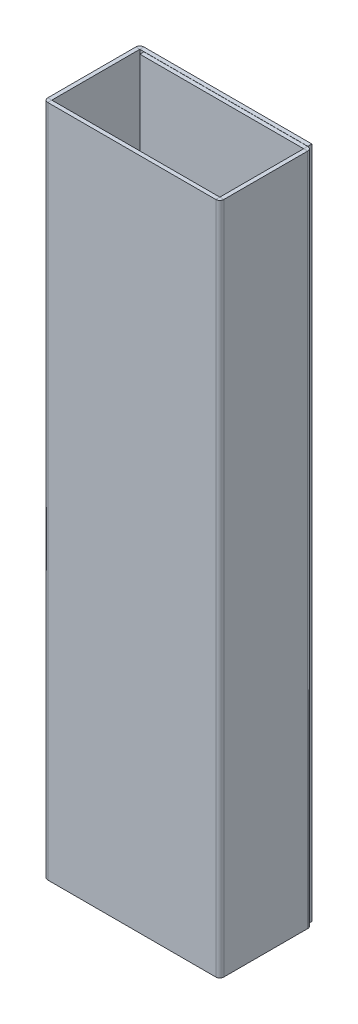
ISO-10303-21;
HEADER;
FILE_DESCRIPTION(('STEP AP214'),'2;1');
FILE_NAME('part.step','',(''),(''),'','','');
FILE_SCHEMA(('AUTOMOTIVE_DESIGN { 1 0 10303 214 1 1 1 1 }'));
ENDSEC;
DATA;
#1=APPLICATION_CONTEXT('core data for automotive mechanical design processes');
#2=APPLICATION_PROTOCOL_DEFINITION('international standard','automotive_design',2000,#1);
#3=PRODUCT_CONTEXT('',#1,'mechanical');
#4=PRODUCT('Part','Part','',(#3));
#5=PRODUCT_RELATED_PRODUCT_CATEGORY('part','',(#4));
#6=PRODUCT_DEFINITION_FORMATION('','',#4);
#7=PRODUCT_DEFINITION_CONTEXT('part definition',#1,'design');
#8=PRODUCT_DEFINITION('design','',#6,#7);
#9=PRODUCT_DEFINITION_SHAPE('','',#8);
#10=(LENGTH_UNIT() NAMED_UNIT(*) SI_UNIT(.MILLI.,.METRE.));
#11=(NAMED_UNIT(*) PLANE_ANGLE_UNIT() SI_UNIT($,.RADIAN.));
#12=(NAMED_UNIT(*) SI_UNIT($,.STERADIAN.) SOLID_ANGLE_UNIT());
#13=UNCERTAINTY_MEASURE_WITH_UNIT(LENGTH_MEASURE(1.E-05),#10,'distance_accuracy_value','');
#14=(GEOMETRIC_REPRESENTATION_CONTEXT(3) GLOBAL_UNCERTAINTY_ASSIGNED_CONTEXT((#13)) GLOBAL_UNIT_ASSIGNED_CONTEXT((#10,
#11,#12)) REPRESENTATION_CONTEXT('',''));
#15=CARTESIAN_POINT('',(0.,0.,0.));
#16=DIRECTION('',(0.,0.,1.));
#17=DIRECTION('',(1.,0.,0.));
#18=AXIS2_PLACEMENT_3D('',#15,#16,#17);
#19=CARTESIAN_POINT('',(-4.99,40.,-2.614));
#20=DIRECTION('',(0.,1.,0.));
#21=DIRECTION('',(0.,0.,1.));
#22=AXIS2_PLACEMENT_3D('',#19,#20,#21);
#23=PLANE('',#22);
#24=DIRECTION('',(-1.,0.,0.));
#25=VECTOR('',#24,1.);
#26=CARTESIAN_POINT('',(-4.99,40.,-2.614));
#27=LINE('',#26,#25);
#28=CARTESIAN_POINT('',(-4.99,40.,-2.614));
#29=VERTEX_POINT('',#28);
#30=CARTESIAN_POINT('',(-5.23,40.,-2.614));
#31=VERTEX_POINT('',#30);
#32=EDGE_CURVE('E11',#29,#31,#27,.T.);
#33=ORIENTED_EDGE('',*,*,#32,.F.);
#34=CARTESIAN_POINT('',(-4.989,40.,-2.614));
#35=DIRECTION('',(0.,-1.,0.));
#36=DIRECTION('',(0.,0.,-1.));
#37=AXIS2_PLACEMENT_3D('',#34,#35,#36);
#38=CIRCLE('',#37,0.001);
#39=CARTESIAN_POINT('',(-4.989,40.,-2.615));
#40=VERTEX_POINT('',#39);
#41=EDGE_CURVE('E366',#40,#29,#38,.F.);
#42=ORIENTED_EDGE('',*,*,#41,.F.);
#43=DIRECTION('',(0.,0.,1.));
#44=VECTOR('',#43,1.);
#45=CARTESIAN_POINT('',(-4.989,40.,-2.855));
#46=LINE('',#45,#44);
#47=CARTESIAN_POINT('',(-4.989,40.,-2.855));
#48=VERTEX_POINT('',#47);
#49=EDGE_CURVE('E45',#48,#40,#46,.T.);
#50=ORIENTED_EDGE('',*,*,#49,.F.);
#51=CARTESIAN_POINT('',(-4.989,40.,-2.614));
#52=DIRECTION('',(0.,1.,0.));
#53=DIRECTION('',(1.,0.,0.));
#54=AXIS2_PLACEMENT_3D('',#51,#52,#53);
#55=CIRCLE('',#54,0.241);
#56=EDGE_CURVE('E379',#48,#31,#55,.T.);
#57=ORIENTED_EDGE('',*,*,#56,.T.);
#58=EDGE_LOOP('',(#33,#42,#50,#57));
#59=FACE_BOUND('',#58,.T.);
#60=ADVANCED_FACE('F37',(#59),#23,.T.);
#61=CARTESIAN_POINT('',(-4.989,40.,-2.855));
#62=DIRECTION('',(0.,1.,0.));
#63=DIRECTION('',(0.,0.,1.));
#64=AXIS2_PLACEMENT_3D('',#61,#62,#63);
#65=PLANE('',#64);
#66=DIRECTION('',(0.,0.,1.));
#67=VECTOR('',#66,1.);
#68=CARTESIAN_POINT('',(-4.99,40.,-2.615));
#69=LINE('',#68,#67);
#70=CARTESIAN_POINT('',(-4.99,40.,2.614));
#71=VERTEX_POINT('',#70);
#72=EDGE_CURVE('E370',#29,#71,#69,.T.);
#73=ORIENTED_EDGE('',*,*,#72,.F.);
#74=ORIENTED_EDGE('',*,*,#32,.T.);
#75=DIRECTION('',(0.,0.,1.));
#76=VECTOR('',#75,1.);
#77=CARTESIAN_POINT('',(-5.23,40.,-2.615));
#78=LINE('',#77,#76);
#79=CARTESIAN_POINT('',(-5.23,40.,2.61399999999916));
#80=VERTEX_POINT('',#79);
#81=EDGE_CURVE('E381',#31,#80,#78,.T.);
#82=ORIENTED_EDGE('',*,*,#81,.T.);
#83=DIRECTION('',(1.,0.,3.46944695195362E-12));
#84=VECTOR('',#83,1.);
#85=CARTESIAN_POINT('',(-5.23,40.,2.61399999999916));
#86=LINE('',#85,#84);
#87=EDGE_CURVE('E340',#80,#71,#86,.T.);
#88=ORIENTED_EDGE('',*,*,#87,.T.);
#89=EDGE_LOOP('',(#73,#74,#82,#88));
#90=FACE_BOUND('',#89,.T.);
#91=ADVANCED_FACE('F450',(#90),#65,.T.);
#92=CARTESIAN_POINT('',(-4.989,0.,-2.615));
#93=DIRECTION('',(0.,-1.,0.));
#94=DIRECTION('',(0.,0.,-1.));
#95=AXIS2_PLACEMENT_3D('',#92,#93,#94);
#96=PLANE('',#95);
#97=DIRECTION('',(0.,0.,-1.));
#98=VECTOR('',#97,1.);
#99=CARTESIAN_POINT('',(-4.989,0.,-2.615));
#100=LINE('',#99,#98);
#101=CARTESIAN_POINT('',(-4.989,0.,-2.615));
#102=VERTEX_POINT('',#101);
#103=CARTESIAN_POINT('',(-4.989,0.,-2.855));
#104=VERTEX_POINT('',#103);
#105=EDGE_CURVE('E346',#102,#104,#100,.T.);
#106=ORIENTED_EDGE('',*,*,#105,.F.);
#107=CARTESIAN_POINT('',(-4.989,0.,-2.614));
#108=DIRECTION('',(0.,-1.,0.));
#109=DIRECTION('',(0.,0.,-1.));
#110=AXIS2_PLACEMENT_3D('',#107,#108,#109);
#111=CIRCLE('',#110,0.001);
#112=CARTESIAN_POINT('',(-4.99,0.,-2.614));
#113=VERTEX_POINT('',#112);
#114=EDGE_CURVE('E250',#102,#113,#111,.F.);
#115=ORIENTED_EDGE('',*,*,#114,.T.);
#116=DIRECTION('',(1.,0.,0.));
#117=VECTOR('',#116,1.);
#118=CARTESIAN_POINT('',(-5.23,0.,-2.614));
#119=LINE('',#118,#117);
#120=CARTESIAN_POINT('',(-5.23,0.,-2.614));
#121=VERTEX_POINT('',#120);
#122=EDGE_CURVE('E344',#121,#113,#119,.T.);
#123=ORIENTED_EDGE('',*,*,#122,.F.);
#124=CARTESIAN_POINT('',(-4.989,0.,-2.614));
#125=DIRECTION('',(0.,1.,0.));
#126=DIRECTION('',(1.,0.,0.));
#127=AXIS2_PLACEMENT_3D('',#124,#125,#126);
#128=CIRCLE('',#127,0.241);
#129=EDGE_CURVE('E262',#104,#121,#128,.T.);
#130=ORIENTED_EDGE('',*,*,#129,.F.);
#131=EDGE_LOOP('',(#106,#115,#123,#130));
#132=FACE_BOUND('',#131,.T.);
#133=ADVANCED_FACE('F492',(#132),#96,.T.);
#134=CARTESIAN_POINT('',(-5.23,0.,-2.614));
#135=DIRECTION('',(0.,-1.,0.));
#136=DIRECTION('',(0.,0.,-1.));
#137=AXIS2_PLACEMENT_3D('',#134,#135,#136);
#138=PLANE('',#137);
#139=DIRECTION('',(-1.,0.,0.));
#140=VECTOR('',#139,1.);
#141=CARTESIAN_POINT('',(4.99,0.,-2.615));
#142=LINE('',#141,#140);
#143=CARTESIAN_POINT('',(4.99,0.,-2.615));
#144=VERTEX_POINT('',#143);
#145=EDGE_CURVE('E253',#144,#102,#142,.T.);
#146=ORIENTED_EDGE('',*,*,#145,.T.);
#147=ORIENTED_EDGE('',*,*,#105,.T.);
#148=DIRECTION('',(-1.,0.,0.));
#149=VECTOR('',#148,1.);
#150=CARTESIAN_POINT('',(4.99,0.,-2.855));
#151=LINE('',#150,#149);
#152=CARTESIAN_POINT('',(4.99,0.,-2.855));
#153=VERTEX_POINT('',#152);
#154=EDGE_CURVE('E259',#153,#104,#151,.T.);
#155=ORIENTED_EDGE('',*,*,#154,.F.);
#156=DIRECTION('',(0.,0.,1.));
#157=VECTOR('',#156,1.);
#158=CARTESIAN_POINT('',(4.99,0.,-2.855));
#159=LINE('',#158,#157);
#160=EDGE_CURVE('E256',#153,#144,#159,.T.);
#161=ORIENTED_EDGE('',*,*,#160,.T.);
#162=EDGE_LOOP('',(#146,#147,#155,#161));
#163=FACE_BOUND('',#162,.T.);
#164=ADVANCED_FACE('F496',(#163),#138,.T.);
#165=CARTESIAN_POINT('',(-4.989,40.,2.615));
#166=DIRECTION('',(0.,1.,0.));
#167=DIRECTION('',(0.,0.,1.));
#168=AXIS2_PLACEMENT_3D('',#165,#166,#167);
#169=PLANE('',#168);
#170=DIRECTION('',(0.,0.,1.));
#171=VECTOR('',#170,1.);
#172=CARTESIAN_POINT('',(-4.989,40.,2.615));
#173=LINE('',#172,#171);
#174=CARTESIAN_POINT('',(-4.989,40.,2.615));
#175=VERTEX_POINT('',#174);
#176=CARTESIAN_POINT('',(-4.989,40.,2.855));
#177=VERTEX_POINT('',#176);
#178=EDGE_CURVE('E342',#175,#177,#173,.T.);
#179=ORIENTED_EDGE('',*,*,#178,.F.);
#180=CARTESIAN_POINT('',(-4.989,40.,2.614));
#181=DIRECTION('',(0.,-1.,0.));
#182=DIRECTION('',(0.,0.,-1.));
#183=AXIS2_PLACEMENT_3D('',#180,#181,#182);
#184=CIRCLE('',#183,0.001);
#185=EDGE_CURVE('E440',#71,#175,#184,.F.);
#186=ORIENTED_EDGE('',*,*,#185,.F.);
#187=ORIENTED_EDGE('',*,*,#87,.F.);
#188=CARTESIAN_POINT('',(-4.989,40.,2.614));
#189=DIRECTION('',(0.,1.,0.));
#190=DIRECTION('',(1.,0.,0.));
#191=AXIS2_PLACEMENT_3D('',#188,#189,#190);
#192=CIRCLE('',#191,0.241);
#193=EDGE_CURVE('E384',#80,#177,#192,.T.);
#194=ORIENTED_EDGE('',*,*,#193,.T.);
#195=EDGE_LOOP('',(#179,#186,#187,#194));
#196=FACE_BOUND('',#195,.T.);
#197=ADVANCED_FACE('F457',(#196),#169,.T.);
#198=CARTESIAN_POINT('',(-5.23,40.,2.61399999999916));
#199=DIRECTION('',(0.,1.,0.));
#200=DIRECTION('',(0.,0.,1.));
#201=AXIS2_PLACEMENT_3D('',#198,#199,#200);
#202=PLANE('',#201);
#203=DIRECTION('',(1.,0.,0.));
#204=VECTOR('',#203,1.);
#205=CARTESIAN_POINT('',(-4.99,40.,2.615));
#206=LINE('',#205,#204);
#207=CARTESIAN_POINT('',(4.989,40.,2.615));
#208=VERTEX_POINT('',#207);
#209=EDGE_CURVE('E437',#175,#208,#206,.T.);
#210=ORIENTED_EDGE('',*,*,#209,.F.);
#211=ORIENTED_EDGE('',*,*,#178,.T.);
#212=DIRECTION('',(1.,0.,0.));
#213=VECTOR('',#212,1.);
#214=CARTESIAN_POINT('',(-4.99,40.,2.855));
#215=LINE('',#214,#213);
#216=CARTESIAN_POINT('',(4.98899999999979,40.,2.855));
#217=VERTEX_POINT('',#216);
#218=EDGE_CURVE('E204',#177,#217,#215,.T.);
#219=ORIENTED_EDGE('',*,*,#218,.T.);
#220=DIRECTION('',(8.67361737988404E-13,0.,-1.));
#221=VECTOR('',#220,1.);
#222=CARTESIAN_POINT('',(4.98899999999979,40.,2.855));
#223=LINE('',#222,#221);
#224=EDGE_CURVE('E195',#217,#208,#223,.T.);
#225=ORIENTED_EDGE('',*,*,#224,.T.);
#226=EDGE_LOOP('',(#210,#211,#219,#225));
#227=FACE_BOUND('',#226,.T.);
#228=ADVANCED_FACE('F390',(#227),#202,.T.);
#229=CARTESIAN_POINT('',(-4.99,0.,2.614));
#230=DIRECTION('',(0.,-1.,0.));
#231=DIRECTION('',(0.,0.,-1.));
#232=AXIS2_PLACEMENT_3D('',#229,#230,#231);
#233=PLANE('',#232);
#234=DIRECTION('',(-1.,0.,-3.46944695195362E-12));
#235=VECTOR('',#234,1.);
#236=CARTESIAN_POINT('',(-4.99,0.,2.614));
#237=LINE('',#236,#235);
#238=CARTESIAN_POINT('',(-4.99,0.,2.614));
#239=VERTEX_POINT('',#238);
#240=CARTESIAN_POINT('',(-5.23,0.,2.61399999999916));
#241=VERTEX_POINT('',#240);
#242=EDGE_CURVE('E338',#239,#241,#237,.T.);
#243=ORIENTED_EDGE('',*,*,#242,.F.);
#244=CARTESIAN_POINT('',(-4.989,0.,2.614));
#245=DIRECTION('',(0.,-1.,0.));
#246=DIRECTION('',(0.,0.,-1.));
#247=AXIS2_PLACEMENT_3D('',#244,#245,#246);
#248=CIRCLE('',#247,0.001);
#249=CARTESIAN_POINT('',(-4.989,0.,2.615));
#250=VERTEX_POINT('',#249);
#251=EDGE_CURVE('E244',#239,#250,#248,.F.);
#252=ORIENTED_EDGE('',*,*,#251,.T.);
#253=DIRECTION('',(0.,0.,-1.));
#254=VECTOR('',#253,1.);
#255=CARTESIAN_POINT('',(-4.989,0.,2.855));
#256=LINE('',#255,#254);
#257=CARTESIAN_POINT('',(-4.989,0.,2.855));
#258=VERTEX_POINT('',#257);
#259=EDGE_CURVE('E194',#258,#250,#256,.T.);
#260=ORIENTED_EDGE('',*,*,#259,.F.);
#261=CARTESIAN_POINT('',(-4.989,0.,2.614));
#262=DIRECTION('',(0.,1.,0.));
#263=DIRECTION('',(1.,0.,0.));
#264=AXIS2_PLACEMENT_3D('',#261,#262,#263);
#265=CIRCLE('',#264,0.241);
#266=EDGE_CURVE('E268',#241,#258,#265,.T.);
#267=ORIENTED_EDGE('',*,*,#266,.F.);
#268=EDGE_LOOP('',(#243,#252,#260,#267));
#269=FACE_BOUND('',#268,.T.);
#270=ADVANCED_FACE('F466',(#269),#233,.T.);
#271=CARTESIAN_POINT('',(-4.989,0.,2.855));
#272=DIRECTION('',(0.,-1.,0.));
#273=DIRECTION('',(0.,0.,-1.));
#274=AXIS2_PLACEMENT_3D('',#271,#272,#273);
#275=PLANE('',#274);
#276=DIRECTION('',(0.,0.,1.));
#277=VECTOR('',#276,1.);
#278=CARTESIAN_POINT('',(-4.99,0.,-2.615));
#279=LINE('',#278,#277);
#280=EDGE_CURVE('E247',#113,#239,#279,.T.);
#281=ORIENTED_EDGE('',*,*,#280,.T.);
#282=ORIENTED_EDGE('',*,*,#242,.T.);
#283=DIRECTION('',(0.,0.,1.));
#284=VECTOR('',#283,1.);
#285=CARTESIAN_POINT('',(-5.23,0.,-2.615));
#286=LINE('',#285,#284);
#287=EDGE_CURVE('E265',#121,#241,#286,.T.);
#288=ORIENTED_EDGE('',*,*,#287,.F.);
#289=ORIENTED_EDGE('',*,*,#122,.T.);
#290=EDGE_LOOP('',(#281,#282,#288,#289));
#291=FACE_BOUND('',#290,.T.);
#292=ADVANCED_FACE('F470',(#291),#275,.T.);
#293=CARTESIAN_POINT('',(4.99,40.,2.614));
#294=DIRECTION('',(0.,1.,0.));
#295=DIRECTION('',(0.,0.,1.));
#296=AXIS2_PLACEMENT_3D('',#293,#294,#295);
#297=PLANE('',#296);
#298=DIRECTION('',(1.,0.,0.));
#299=VECTOR('',#298,1.);
#300=CARTESIAN_POINT('',(4.99,40.,2.614));
#301=LINE('',#300,#299);
#302=CARTESIAN_POINT('',(4.99,40.,2.614));
#303=VERTEX_POINT('',#302);
#304=CARTESIAN_POINT('',(5.23,40.,2.614));
#305=VERTEX_POINT('',#304);
#306=EDGE_CURVE('E182',#303,#305,#301,.T.);
#307=ORIENTED_EDGE('',*,*,#306,.F.);
#308=CARTESIAN_POINT('',(4.989,40.,2.614));
#309=DIRECTION('',(0.,-1.,0.));
#310=DIRECTION('',(0.,0.,-1.));
#311=AXIS2_PLACEMENT_3D('',#308,#309,#310);
#312=CIRCLE('',#311,0.001);
#313=EDGE_CURVE('E402',#208,#303,#312,.F.);
#314=ORIENTED_EDGE('',*,*,#313,.F.);
#315=ORIENTED_EDGE('',*,*,#224,.F.);
#316=CARTESIAN_POINT('',(4.989,40.,2.614));
#317=DIRECTION('',(0.,1.,0.));
#318=DIRECTION('',(1.,0.,0.));
#319=AXIS2_PLACEMENT_3D('',#316,#317,#318);
#320=CIRCLE('',#319,0.241);
#321=EDGE_CURVE('E198',#217,#305,#320,.T.);
#322=ORIENTED_EDGE('',*,*,#321,.T.);
#323=EDGE_LOOP('',(#307,#314,#315,#322));
#324=FACE_BOUND('',#323,.T.);
#325=ADVANCED_FACE('F200',(#324),#297,.T.);
#326=CARTESIAN_POINT('',(4.98899999999979,40.,2.855));
#327=DIRECTION('',(0.,1.,0.));
#328=DIRECTION('',(0.,0.,1.));
#329=AXIS2_PLACEMENT_3D('',#326,#327,#328);
#330=PLANE('',#329);
#331=DIRECTION('',(0.,0.,-1.));
#332=VECTOR('',#331,1.);
#333=CARTESIAN_POINT('',(4.99,40.,2.615));
#334=LINE('',#333,#332);
#335=CARTESIAN_POINT('',(4.99,40.,-2.364));
#336=VERTEX_POINT('',#335);
#337=EDGE_CURVE('E189',#303,#336,#334,.T.);
#338=ORIENTED_EDGE('',*,*,#337,.F.);
#339=ORIENTED_EDGE('',*,*,#306,.T.);
#340=DIRECTION('',(0.,0.,-1.));
#341=VECTOR('',#340,1.);
#342=CARTESIAN_POINT('',(5.23,40.,2.615));
#343=LINE('',#342,#341);
#344=CARTESIAN_POINT('',(5.23,40.,-2.364));
#345=VERTEX_POINT('',#344);
#346=EDGE_CURVE('E186',#305,#345,#343,.T.);
#347=ORIENTED_EDGE('',*,*,#346,.T.);
#348=DIRECTION('',(-1.,0.,0.));
#349=VECTOR('',#348,1.);
#350=CARTESIAN_POINT('',(5.23,40.,-2.364));
#351=LINE('',#350,#349);
#352=EDGE_CURVE('E329',#345,#336,#351,.T.);
#353=ORIENTED_EDGE('',*,*,#352,.T.);
#354=EDGE_LOOP('',(#338,#339,#347,#353));
#355=FACE_BOUND('',#354,.T.);
#356=ADVANCED_FACE('F184',(#355),#330,.T.);
#357=CARTESIAN_POINT('',(4.989,0.,2.615));
#358=DIRECTION('',(0.,-1.,0.));
#359=DIRECTION('',(0.,0.,-1.));
#360=AXIS2_PLACEMENT_3D('',#357,#358,#359);
#361=PLANE('',#360);
#362=DIRECTION('',(-8.67361737988404E-13,0.,1.));
#363=VECTOR('',#362,1.);
#364=CARTESIAN_POINT('',(4.989,0.,2.615));
#365=LINE('',#364,#363);
#366=CARTESIAN_POINT('',(4.989,0.,2.615));
#367=VERTEX_POINT('',#366);
#368=CARTESIAN_POINT('',(4.98899999999979,0.,2.855));
#369=VERTEX_POINT('',#368);
#370=EDGE_CURVE('E334',#367,#369,#365,.T.);
#371=ORIENTED_EDGE('',*,*,#370,.F.);
#372=CARTESIAN_POINT('',(4.989,0.,2.614));
#373=DIRECTION('',(0.,-1.,0.));
#374=DIRECTION('',(0.,0.,-1.));
#375=AXIS2_PLACEMENT_3D('',#372,#373,#374);
#376=CIRCLE('',#375,0.001);
#377=CARTESIAN_POINT('',(4.99,0.,2.614));
#378=VERTEX_POINT('',#377);
#379=EDGE_CURVE('E238',#367,#378,#376,.F.);
#380=ORIENTED_EDGE('',*,*,#379,.T.);
#381=DIRECTION('',(-1.,0.,0.));
#382=VECTOR('',#381,1.);
#383=CARTESIAN_POINT('',(5.23,0.,2.614));
#384=LINE('',#383,#382);
#385=CARTESIAN_POINT('',(5.23,0.,2.614));
#386=VERTEX_POINT('',#385);
#387=EDGE_CURVE('E332',#386,#378,#384,.T.);
#388=ORIENTED_EDGE('',*,*,#387,.F.);
#389=CARTESIAN_POINT('',(4.989,0.,2.614));
#390=DIRECTION('',(0.,1.,0.));
#391=DIRECTION('',(1.,0.,0.));
#392=AXIS2_PLACEMENT_3D('',#389,#390,#391);
#393=CIRCLE('',#392,0.241);
#394=EDGE_CURVE('E211',#369,#386,#393,.T.);
#395=ORIENTED_EDGE('',*,*,#394,.F.);
#396=EDGE_LOOP('',(#371,#380,#388,#395));
#397=FACE_BOUND('',#396,.T.);
#398=ADVANCED_FACE('F396',(#397),#361,.T.);
#399=CARTESIAN_POINT('',(5.23,0.,2.614));
#400=DIRECTION('',(0.,-1.,0.));
#401=DIRECTION('',(0.,0.,-1.));
#402=AXIS2_PLACEMENT_3D('',#399,#400,#401);
#403=PLANE('',#402);
#404=DIRECTION('',(1.,0.,0.));
#405=VECTOR('',#404,1.);
#406=CARTESIAN_POINT('',(-4.99,0.,2.615));
#407=LINE('',#406,#405);
#408=EDGE_CURVE('E241',#250,#367,#407,.T.);
#409=ORIENTED_EDGE('',*,*,#408,.T.);
#410=ORIENTED_EDGE('',*,*,#370,.T.);
#411=DIRECTION('',(1.,0.,0.));
#412=VECTOR('',#411,1.);
#413=CARTESIAN_POINT('',(-4.99,0.,2.855));
#414=LINE('',#413,#412);
#415=EDGE_CURVE('E271',#258,#369,#414,.T.);
#416=ORIENTED_EDGE('',*,*,#415,.F.);
#417=ORIENTED_EDGE('',*,*,#259,.T.);
#418=EDGE_LOOP('',(#409,#410,#416,#417));
#419=FACE_BOUND('',#418,.T.);
#420=ADVANCED_FACE('F476',(#419),#403,.T.);
#421=CARTESIAN_POINT('',(4.989,40.,-2.365));
#422=DIRECTION('',(0.,1.,0.));
#423=DIRECTION('',(0.,0.,1.));
#424=AXIS2_PLACEMENT_3D('',#421,#422,#423);
#425=PLANE('',#424);
#426=DIRECTION('',(0.,0.,-1.));
#427=VECTOR('',#426,1.);
#428=CARTESIAN_POINT('',(4.989,40.,-2.365));
#429=LINE('',#428,#427);
#430=CARTESIAN_POINT('',(4.989,40.,-2.365));
#431=VERTEX_POINT('',#430);
#432=CARTESIAN_POINT('',(4.989,40.,-2.605));
#433=VERTEX_POINT('',#432);
#434=EDGE_CURVE('E53',#431,#433,#429,.T.);
#435=ORIENTED_EDGE('',*,*,#434,.F.);
#436=CARTESIAN_POINT('',(4.989,40.,-2.364));
#437=DIRECTION('',(0.,-1.,0.));
#438=DIRECTION('',(0.,0.,-1.));
#439=AXIS2_PLACEMENT_3D('',#436,#437,#438);
#440=CIRCLE('',#439,0.001);
#441=EDGE_CURVE('E430',#336,#431,#440,.F.);
#442=ORIENTED_EDGE('',*,*,#441,.F.);
#443=ORIENTED_EDGE('',*,*,#352,.F.);
#444=CARTESIAN_POINT('',(4.989,40.,-2.364));
#445=DIRECTION('',(0.,1.,0.));
#446=DIRECTION('',(1.,0.,0.));
#447=AXIS2_PLACEMENT_3D('',#444,#445,#446);
#448=CIRCLE('',#447,0.241);
#449=EDGE_CURVE('E219',#345,#433,#448,.T.);
#450=ORIENTED_EDGE('',*,*,#449,.T.);
#451=EDGE_LOOP('',(#435,#442,#443,#450));
#452=FACE_BOUND('',#451,.T.);
#453=ADVANCED_FACE('F478',(#452),#425,.T.);
#454=CARTESIAN_POINT('',(5.23,40.,-2.364));
#455=DIRECTION('',(0.,1.,0.));
#456=DIRECTION('',(0.,0.,1.));
#457=AXIS2_PLACEMENT_3D('',#454,#455,#456);
#458=PLANE('',#457);
#459=DIRECTION('',(-1.,0.,0.));
#460=VECTOR('',#459,1.);
#461=CARTESIAN_POINT('',(4.99,40.,-2.365));
#462=LINE('',#461,#460);
#463=CARTESIAN_POINT('',(-4.74,40.,-2.365));
#464=VERTEX_POINT('',#463);
#465=EDGE_CURVE('E428',#431,#464,#462,.T.);
#466=ORIENTED_EDGE('',*,*,#465,.F.);
#467=ORIENTED_EDGE('',*,*,#434,.T.);
#468=DIRECTION('',(-1.,0.,0.));
#469=VECTOR('',#468,1.);
#470=CARTESIAN_POINT('',(4.99,40.,-2.605));
#471=LINE('',#470,#469);
#472=CARTESIAN_POINT('',(-4.74,40.,-2.605));
#473=VERTEX_POINT('',#472);
#474=EDGE_CURVE('E131',#433,#473,#471,.T.);
#475=ORIENTED_EDGE('',*,*,#474,.T.);
#476=DIRECTION('',(0.,0.,-1.));
#477=VECTOR('',#476,1.);
#478=CARTESIAN_POINT('',(-4.74,40.,-2.365));
#479=LINE('',#478,#477);
#480=EDGE_CURVE('E426',#464,#473,#479,.T.);
#481=ORIENTED_EDGE('',*,*,#480,.F.);
#482=EDGE_LOOP('',(#466,#467,#475,#481));
#483=FACE_BOUND('',#482,.T.);
#484=ADVANCED_FACE('F484',(#483),#458,.T.);
#485=CARTESIAN_POINT('',(4.99,0.,-2.364));
#486=DIRECTION('',(0.,-1.,0.));
#487=DIRECTION('',(0.,0.,-1.));
#488=AXIS2_PLACEMENT_3D('',#485,#486,#487);
#489=PLANE('',#488);
#490=DIRECTION('',(1.,0.,0.));
#491=VECTOR('',#490,1.);
#492=CARTESIAN_POINT('',(4.99,0.,-2.364));
#493=LINE('',#492,#491);
#494=CARTESIAN_POINT('',(4.99,0.,-2.364));
#495=VERTEX_POINT('',#494);
#496=CARTESIAN_POINT('',(5.23,0.,-2.364));
#497=VERTEX_POINT('',#496);
#498=EDGE_CURVE('E118',#495,#497,#493,.T.);
#499=ORIENTED_EDGE('',*,*,#498,.F.);
#500=CARTESIAN_POINT('',(4.989,0.,-2.364));
#501=DIRECTION('',(0.,-1.,0.));
#502=DIRECTION('',(0.,0.,-1.));
#503=AXIS2_PLACEMENT_3D('',#500,#501,#502);
#504=CIRCLE('',#503,0.001);
#505=CARTESIAN_POINT('',(4.989,0.,-2.365));
#506=VERTEX_POINT('',#505);
#507=EDGE_CURVE('E234',#495,#506,#504,.F.);
#508=ORIENTED_EDGE('',*,*,#507,.T.);
#509=DIRECTION('',(0.,0.,1.));
#510=VECTOR('',#509,1.);
#511=CARTESIAN_POINT('',(4.989,0.,-2.605));
#512=LINE('',#511,#510);
#513=CARTESIAN_POINT('',(4.989,0.,-2.605));
#514=VERTEX_POINT('',#513);
#515=EDGE_CURVE('E125',#514,#506,#512,.T.);
#516=ORIENTED_EDGE('',*,*,#515,.F.);
#517=CARTESIAN_POINT('',(4.989,0.,-2.364));
#518=DIRECTION('',(0.,1.,0.));
#519=DIRECTION('',(1.,0.,0.));
#520=AXIS2_PLACEMENT_3D('',#517,#518,#519);
#521=CIRCLE('',#520,0.241);
#522=EDGE_CURVE('E277',#497,#514,#521,.T.);
#523=ORIENTED_EDGE('',*,*,#522,.F.);
#524=EDGE_LOOP('',(#499,#508,#516,#523));
#525=FACE_BOUND('',#524,.T.);
#526=ADVANCED_FACE('F413',(#525),#489,.T.);
#527=CARTESIAN_POINT('',(4.989,0.,-2.605));
#528=DIRECTION('',(0.,-1.,0.));
#529=DIRECTION('',(0.,0.,-1.));
#530=AXIS2_PLACEMENT_3D('',#527,#528,#529);
#531=PLANE('',#530);
#532=DIRECTION('',(0.,0.,-1.));
#533=VECTOR('',#532,1.);
#534=CARTESIAN_POINT('',(4.99,0.,2.615));
#535=LINE('',#534,#533);
#536=EDGE_CURVE('E236',#378,#495,#535,.T.);
#537=ORIENTED_EDGE('',*,*,#536,.T.);
#538=ORIENTED_EDGE('',*,*,#498,.T.);
#539=DIRECTION('',(0.,0.,-1.));
#540=VECTOR('',#539,1.);
#541=CARTESIAN_POINT('',(5.23,0.,2.615));
#542=LINE('',#541,#540);
#543=EDGE_CURVE('E275',#386,#497,#542,.T.);
#544=ORIENTED_EDGE('',*,*,#543,.F.);
#545=ORIENTED_EDGE('',*,*,#387,.T.);
#546=EDGE_LOOP('',(#537,#538,#544,#545));
#547=FACE_BOUND('',#546,.T.);
#548=ADVANCED_FACE('F398',(#547),#531,.T.);
#549=CARTESIAN_POINT('',(4.99,40.,-2.605));
#550=DIRECTION('',(0.,0.,1.));
#551=DIRECTION('',(1.,0.,0.));
#552=AXIS2_PLACEMENT_3D('',#549,#550,#551);
#553=PLANE('',#552);
#554=DIRECTION('',(-1.,0.,0.));
#555=VECTOR('',#554,1.);
#556=CARTESIAN_POINT('',(4.99,0.,-2.605));
#557=LINE('',#556,#555);
#558=CARTESIAN_POINT('',(-4.74,0.,-2.605));
#559=VERTEX_POINT('',#558);
#560=EDGE_CURVE('E225',#514,#559,#557,.T.);
#561=ORIENTED_EDGE('',*,*,#560,.T.);
#562=DIRECTION('',(0.,-1.,0.));
#563=VECTOR('',#562,1.);
#564=CARTESIAN_POINT('',(-4.74,40.,-2.605));
#565=LINE('',#564,#563);
#566=EDGE_CURVE('E325',#473,#559,#565,.T.);
#567=ORIENTED_EDGE('',*,*,#566,.F.);
#568=ORIENTED_EDGE('',*,*,#474,.F.);
#569=DIRECTION('',(0.,-1.,0.));
#570=VECTOR('',#569,1.);
#571=CARTESIAN_POINT('',(4.989,40.,-2.605));
#572=LINE('',#571,#570);
#573=EDGE_CURVE('E221',#433,#514,#572,.T.);
#574=ORIENTED_EDGE('',*,*,#573,.T.);
#575=EDGE_LOOP('',(#561,#567,#568,#574));
#576=FACE_BOUND('',#575,.T.);
#577=ADVANCED_FACE('F419',(#576),#553,.F.);
#578=CARTESIAN_POINT('',(-4.74,40.,-2.365));
#579=DIRECTION('',(-1.,0.,0.));
#580=DIRECTION('',(0.,0.,1.));
#581=AXIS2_PLACEMENT_3D('',#578,#579,#580);
#582=PLANE('',#581);
#583=DIRECTION('',(0.,0.,-1.));
#584=VECTOR('',#583,1.);
#585=CARTESIAN_POINT('',(-4.74,0.,-2.365));
#586=LINE('',#585,#584);
#587=CARTESIAN_POINT('',(-4.74,0.,-2.365));
#588=VERTEX_POINT('',#587);
#589=EDGE_CURVE('E228',#588,#559,#586,.T.);
#590=ORIENTED_EDGE('',*,*,#589,.F.);
#591=DIRECTION('',(0.,-1.,0.));
#592=VECTOR('',#591,1.);
#593=CARTESIAN_POINT('',(-4.74,40.,-2.365));
#594=LINE('',#593,#592);
#595=EDGE_CURVE('E323',#464,#588,#594,.T.);
#596=ORIENTED_EDGE('',*,*,#595,.F.);
#597=ORIENTED_EDGE('',*,*,#480,.T.);
#598=ORIENTED_EDGE('',*,*,#566,.T.);
#599=EDGE_LOOP('',(#590,#596,#597,#598));
#600=FACE_BOUND('',#599,.T.);
#601=ADVANCED_FACE('F424',(#600),#582,.T.);
#602=CARTESIAN_POINT('',(4.99,40.,-2.365));
#603=DIRECTION('',(0.,0.,1.));
#604=DIRECTION('',(1.,0.,0.));
#605=AXIS2_PLACEMENT_3D('',#602,#603,#604);
#606=PLANE('',#605);
#607=DIRECTION('',(-1.,0.,0.));
#608=VECTOR('',#607,1.);
#609=CARTESIAN_POINT('',(4.99,0.,-2.365));
#610=LINE('',#609,#608);
#611=EDGE_CURVE('E231',#506,#588,#610,.T.);
#612=ORIENTED_EDGE('',*,*,#611,.F.);
#613=DIRECTION('',(0.,-1.,0.));
#614=VECTOR('',#613,1.);
#615=CARTESIAN_POINT('',(4.989,40.,-2.365));
#616=LINE('',#615,#614);
#617=EDGE_CURVE('E320',#431,#506,#616,.T.);
#618=ORIENTED_EDGE('',*,*,#617,.F.);
#619=ORIENTED_EDGE('',*,*,#465,.T.);
#620=ORIENTED_EDGE('',*,*,#595,.T.);
#621=EDGE_LOOP('',(#612,#618,#619,#620));
#622=FACE_BOUND('',#621,.T.);
#623=ADVANCED_FACE('F580',(#622),#606,.T.);
#624=CARTESIAN_POINT('',(4.989,40.,-2.364));
#625=DIRECTION('',(0.,-1.,0.));
#626=DIRECTION('',(0.,0.,-1.));
#627=AXIS2_PLACEMENT_3D('',#624,#625,#626);
#628=CYLINDRICAL_SURFACE('',#627,0.001);
#629=ORIENTED_EDGE('',*,*,#507,.F.);
#630=DIRECTION('',(0.,-1.,0.));
#631=VECTOR('',#630,1.);
#632=CARTESIAN_POINT('',(4.99,40.,-2.364));
#633=LINE('',#632,#631);
#634=EDGE_CURVE('E317',#336,#495,#633,.T.);
#635=ORIENTED_EDGE('',*,*,#634,.F.);
#636=ORIENTED_EDGE('',*,*,#441,.T.);
#637=ORIENTED_EDGE('',*,*,#617,.T.);
#638=EDGE_LOOP('',(#629,#635,#636,#637));
#639=FACE_BOUND('',#638,.T.);
#640=ADVANCED_FACE('F410',(#639),#628,.F.);
#641=CARTESIAN_POINT('',(4.99,40.,2.615));
#642=DIRECTION('',(-1.,0.,0.));
#643=DIRECTION('',(0.,0.,1.));
#644=AXIS2_PLACEMENT_3D('',#641,#642,#643);
#645=PLANE('',#644);
#646=ORIENTED_EDGE('',*,*,#536,.F.);
#647=DIRECTION('',(0.,-1.,0.));
#648=VECTOR('',#647,1.);
#649=CARTESIAN_POINT('',(4.99,40.,2.614));
#650=LINE('',#649,#648);
#651=EDGE_CURVE('E314',#303,#378,#650,.T.);
#652=ORIENTED_EDGE('',*,*,#651,.F.);
#653=ORIENTED_EDGE('',*,*,#337,.T.);
#654=ORIENTED_EDGE('',*,*,#634,.T.);
#655=EDGE_LOOP('',(#646,#652,#653,#654));
#656=FACE_BOUND('',#655,.T.);
#657=ADVANCED_FACE('F404',(#656),#645,.T.);
#658=CARTESIAN_POINT('',(4.989,40.,2.614));
#659=DIRECTION('',(0.,-1.,0.));
#660=DIRECTION('',(0.,0.,-1.));
#661=AXIS2_PLACEMENT_3D('',#658,#659,#660);
#662=CYLINDRICAL_SURFACE('',#661,0.001);
#663=ORIENTED_EDGE('',*,*,#379,.F.);
#664=DIRECTION('',(0.,-1.,0.));
#665=VECTOR('',#664,1.);
#666=CARTESIAN_POINT('',(4.989,40.,2.615));
#667=LINE('',#666,#665);
#668=EDGE_CURVE('E311',#208,#367,#667,.T.);
#669=ORIENTED_EDGE('',*,*,#668,.F.);
#670=ORIENTED_EDGE('',*,*,#313,.T.);
#671=ORIENTED_EDGE('',*,*,#651,.T.);
#672=EDGE_LOOP('',(#663,#669,#670,#671));
#673=FACE_BOUND('',#672,.T.);
#674=ADVANCED_FACE('F401',(#673),#662,.F.);
#675=CARTESIAN_POINT('',(-4.99,40.,2.615));
#676=DIRECTION('',(0.,0.,-1.));
#677=DIRECTION('',(-1.,0.,0.));
#678=AXIS2_PLACEMENT_3D('',#675,#676,#677);
#679=PLANE('',#678);
#680=ORIENTED_EDGE('',*,*,#408,.F.);
#681=DIRECTION('',(0.,-1.,0.));
#682=VECTOR('',#681,1.);
#683=CARTESIAN_POINT('',(-4.989,40.,2.615));
#684=LINE('',#683,#682);
#685=EDGE_CURVE('E308',#175,#250,#684,.T.);
#686=ORIENTED_EDGE('',*,*,#685,.F.);
#687=ORIENTED_EDGE('',*,*,#209,.T.);
#688=ORIENTED_EDGE('',*,*,#668,.T.);
#689=EDGE_LOOP('',(#680,#686,#687,#688));
#690=FACE_BOUND('',#689,.T.);
#691=ADVANCED_FACE('F463',(#690),#679,.T.);
#692=CARTESIAN_POINT('',(-4.989,40.,2.614));
#693=DIRECTION('',(0.,-1.,0.));
#694=DIRECTION('',(0.,0.,-1.));
#695=AXIS2_PLACEMENT_3D('',#692,#693,#694);
#696=CYLINDRICAL_SURFACE('',#695,0.001);
#697=ORIENTED_EDGE('',*,*,#251,.F.);
#698=DIRECTION('',(0.,-1.,0.));
#699=VECTOR('',#698,1.);
#700=CARTESIAN_POINT('',(-4.99,40.,2.614));
#701=LINE('',#700,#699);
#702=EDGE_CURVE('E305',#71,#239,#701,.T.);
#703=ORIENTED_EDGE('',*,*,#702,.F.);
#704=ORIENTED_EDGE('',*,*,#185,.T.);
#705=ORIENTED_EDGE('',*,*,#685,.T.);
#706=EDGE_LOOP('',(#697,#703,#704,#705));
#707=FACE_BOUND('',#706,.T.);
#708=ADVANCED_FACE('F456',(#707),#696,.F.);
#709=CARTESIAN_POINT('',(-4.99,40.,-2.615));
#710=DIRECTION('',(1.,0.,0.));
#711=DIRECTION('',(0.,0.,-1.));
#712=AXIS2_PLACEMENT_3D('',#709,#710,#711);
#713=PLANE('',#712);
#714=ORIENTED_EDGE('',*,*,#280,.F.);
#715=DIRECTION('',(0.,-1.,0.));
#716=VECTOR('',#715,1.);
#717=CARTESIAN_POINT('',(-4.99,40.,-2.614));
#718=LINE('',#717,#716);
#719=EDGE_CURVE('E302',#29,#113,#718,.T.);
#720=ORIENTED_EDGE('',*,*,#719,.F.);
#721=ORIENTED_EDGE('',*,*,#72,.T.);
#722=ORIENTED_EDGE('',*,*,#702,.T.);
#723=EDGE_LOOP('',(#714,#720,#721,#722));
#724=FACE_BOUND('',#723,.T.);
#725=ADVANCED_FACE('F446',(#724),#713,.T.);
#726=CARTESIAN_POINT('',(-4.989,40.,-2.614));
#727=DIRECTION('',(0.,-1.,0.));
#728=DIRECTION('',(0.,0.,-1.));
#729=AXIS2_PLACEMENT_3D('',#726,#727,#728);
#730=CYLINDRICAL_SURFACE('',#729,0.001);
#731=ORIENTED_EDGE('',*,*,#114,.F.);
#732=DIRECTION('',(0.,-1.,0.));
#733=VECTOR('',#732,1.);
#734=CARTESIAN_POINT('',(-4.989,40.,-2.615));
#735=LINE('',#734,#733);
#736=EDGE_CURVE('E299',#40,#102,#735,.T.);
#737=ORIENTED_EDGE('',*,*,#736,.F.);
#738=ORIENTED_EDGE('',*,*,#41,.T.);
#739=ORIENTED_EDGE('',*,*,#719,.T.);
#740=EDGE_LOOP('',(#731,#737,#738,#739));
#741=FACE_BOUND('',#740,.T.);
#742=ADVANCED_FACE('F365',(#741),#730,.F.);
#743=CARTESIAN_POINT('',(4.99,40.,-2.615));
#744=DIRECTION('',(0.,0.,1.));
#745=DIRECTION('',(1.,0.,0.));
#746=AXIS2_PLACEMENT_3D('',#743,#744,#745);
#747=PLANE('',#746);
#748=ORIENTED_EDGE('',*,*,#145,.F.);
#749=DIRECTION('',(0.,-1.,0.));
#750=VECTOR('',#749,1.);
#751=CARTESIAN_POINT('',(4.99,40.,-2.615));
#752=LINE('',#751,#750);
#753=CARTESIAN_POINT('',(4.99,40.,-2.615));
#754=VERTEX_POINT('',#753);
#755=EDGE_CURVE('E297',#754,#144,#752,.T.);
#756=ORIENTED_EDGE('',*,*,#755,.F.);
#757=DIRECTION('',(-1.,0.,0.));
#758=VECTOR('',#757,1.);
#759=CARTESIAN_POINT('',(4.99,40.,-2.615));
#760=LINE('',#759,#758);
#761=EDGE_CURVE('E354',#754,#40,#760,.T.);
#762=ORIENTED_EDGE('',*,*,#761,.T.);
#763=ORIENTED_EDGE('',*,*,#736,.T.);
#764=EDGE_LOOP('',(#748,#756,#762,#763));
#765=FACE_BOUND('',#764,.T.);
#766=ADVANCED_FACE('F372',(#765),#747,.T.);
#767=CARTESIAN_POINT('',(4.99,40.,-2.855));
#768=DIRECTION('',(1.,0.,0.));
#769=DIRECTION('',(0.,0.,-1.));
#770=AXIS2_PLACEMENT_3D('',#767,#768,#769);
#771=PLANE('',#770);
#772=ORIENTED_EDGE('',*,*,#160,.F.);
#773=DIRECTION('',(0.,-1.,0.));
#774=VECTOR('',#773,1.);
#775=CARTESIAN_POINT('',(4.99,40.,-2.855));
#776=LINE('',#775,#774);
#777=CARTESIAN_POINT('',(4.99,40.,-2.855));
#778=VERTEX_POINT('',#777);
#779=EDGE_CURVE('E295',#778,#153,#776,.T.);
#780=ORIENTED_EDGE('',*,*,#779,.F.);
#781=DIRECTION('',(0.,0.,1.));
#782=VECTOR('',#781,1.);
#783=CARTESIAN_POINT('',(4.99,40.,-2.855));
#784=LINE('',#783,#782);
#785=EDGE_CURVE('E373',#778,#754,#784,.T.);
#786=ORIENTED_EDGE('',*,*,#785,.T.);
#787=ORIENTED_EDGE('',*,*,#755,.T.);
#788=EDGE_LOOP('',(#772,#780,#786,#787));
#789=FACE_BOUND('',#788,.T.);
#790=ADVANCED_FACE('F663',(#789),#771,.T.);
#791=CARTESIAN_POINT('',(4.99,40.,-2.855));
#792=DIRECTION('',(0.,0.,1.));
#793=DIRECTION('',(1.,0.,0.));
#794=AXIS2_PLACEMENT_3D('',#791,#792,#793);
#795=PLANE('',#794);
#796=ORIENTED_EDGE('',*,*,#154,.T.);
#797=DIRECTION('',(0.,-1.,0.));
#798=VECTOR('',#797,1.);
#799=CARTESIAN_POINT('',(-4.989,40.,-2.855));
#800=LINE('',#799,#798);
#801=EDGE_CURVE('E292',#48,#104,#800,.T.);
#802=ORIENTED_EDGE('',*,*,#801,.F.);
#803=DIRECTION('',(-1.,0.,0.));
#804=VECTOR('',#803,1.);
#805=CARTESIAN_POINT('',(4.99,40.,-2.855));
#806=LINE('',#805,#804);
#807=EDGE_CURVE('E357',#778,#48,#806,.T.);
#808=ORIENTED_EDGE('',*,*,#807,.F.);
#809=ORIENTED_EDGE('',*,*,#779,.T.);
#810=EDGE_LOOP('',(#796,#802,#808,#809));
#811=FACE_BOUND('',#810,.T.);
#812=ADVANCED_FACE('F673',(#811),#795,.F.);
#813=CARTESIAN_POINT('',(-4.989,40.,-2.614));
#814=DIRECTION('',(0.,-1.,0.));
#815=DIRECTION('',(0.,0.,-1.));
#816=AXIS2_PLACEMENT_3D('',#813,#814,#815);
#817=CYLINDRICAL_SURFACE('',#816,0.241);
#818=ORIENTED_EDGE('',*,*,#129,.T.);
#819=DIRECTION('',(0.,-1.,0.));
#820=VECTOR('',#819,1.);
#821=CARTESIAN_POINT('',(-5.23,40.,-2.614));
#822=LINE('',#821,#820);
#823=EDGE_CURVE('E289',#31,#121,#822,.T.);
#824=ORIENTED_EDGE('',*,*,#823,.F.);
#825=ORIENTED_EDGE('',*,*,#56,.F.);
#826=ORIENTED_EDGE('',*,*,#801,.T.);
#827=EDGE_LOOP('',(#818,#824,#825,#826));
#828=FACE_BOUND('',#827,.T.);
#829=ADVANCED_FACE('F684',(#828),#817,.T.);
#830=CARTESIAN_POINT('',(-5.23,40.,-2.615));
#831=DIRECTION('',(1.,0.,0.));
#832=DIRECTION('',(0.,0.,-1.));
#833=AXIS2_PLACEMENT_3D('',#830,#831,#832);
#834=PLANE('',#833);
#835=ORIENTED_EDGE('',*,*,#287,.T.);
#836=DIRECTION('',(0.,-1.,0.));
#837=VECTOR('',#836,1.);
#838=CARTESIAN_POINT('',(-5.23,40.,2.61399999999916));
#839=LINE('',#838,#837);
#840=EDGE_CURVE('E286',#80,#241,#839,.T.);
#841=ORIENTED_EDGE('',*,*,#840,.F.);
#842=ORIENTED_EDGE('',*,*,#81,.F.);
#843=ORIENTED_EDGE('',*,*,#823,.T.);
#844=EDGE_LOOP('',(#835,#841,#842,#843));
#845=FACE_BOUND('',#844,.T.);
#846=ADVANCED_FACE('F472',(#845),#834,.F.);
#847=CARTESIAN_POINT('',(-4.989,40.,2.614));
#848=DIRECTION('',(0.,-1.,0.));
#849=DIRECTION('',(0.,0.,-1.));
#850=AXIS2_PLACEMENT_3D('',#847,#848,#849);
#851=CYLINDRICAL_SURFACE('',#850,0.241);
#852=ORIENTED_EDGE('',*,*,#266,.T.);
#853=DIRECTION('',(0.,-1.,0.));
#854=VECTOR('',#853,1.);
#855=CARTESIAN_POINT('',(-4.989,40.,2.855));
#856=LINE('',#855,#854);
#857=EDGE_CURVE('E283',#177,#258,#856,.T.);
#858=ORIENTED_EDGE('',*,*,#857,.F.);
#859=ORIENTED_EDGE('',*,*,#193,.F.);
#860=ORIENTED_EDGE('',*,*,#840,.T.);
#861=EDGE_LOOP('',(#852,#858,#859,#860));
#862=FACE_BOUND('',#861,.T.);
#863=ADVANCED_FACE('F475',(#862),#851,.T.);
#864=CARTESIAN_POINT('',(-4.99,40.,2.855));
#865=DIRECTION('',(0.,0.,-1.));
#866=DIRECTION('',(-1.,0.,0.));
#867=AXIS2_PLACEMENT_3D('',#864,#865,#866);
#868=PLANE('',#867);
#869=ORIENTED_EDGE('',*,*,#415,.T.);
#870=DIRECTION('',(0.,-1.,0.));
#871=VECTOR('',#870,1.);
#872=CARTESIAN_POINT('',(4.98899999999979,40.,2.855));
#873=LINE('',#872,#871);
#874=EDGE_CURVE('E213',#217,#369,#873,.T.);
#875=ORIENTED_EDGE('',*,*,#874,.F.);
#876=ORIENTED_EDGE('',*,*,#218,.F.);
#877=ORIENTED_EDGE('',*,*,#857,.T.);
#878=EDGE_LOOP('',(#869,#875,#876,#877));
#879=FACE_BOUND('',#878,.T.);
#880=ADVANCED_FACE('F393',(#879),#868,.F.);
#881=CARTESIAN_POINT('',(4.989,40.,2.614));
#882=DIRECTION('',(0.,-1.,0.));
#883=DIRECTION('',(0.,0.,-1.));
#884=AXIS2_PLACEMENT_3D('',#881,#882,#883);
#885=CYLINDRICAL_SURFACE('',#884,0.241);
#886=ORIENTED_EDGE('',*,*,#394,.T.);
#887=DIRECTION('',(0.,-1.,0.));
#888=VECTOR('',#887,1.);
#889=CARTESIAN_POINT('',(5.23,40.,2.614));
#890=LINE('',#889,#888);
#891=EDGE_CURVE('E208',#305,#386,#890,.T.);
#892=ORIENTED_EDGE('',*,*,#891,.F.);
#893=ORIENTED_EDGE('',*,*,#321,.F.);
#894=ORIENTED_EDGE('',*,*,#874,.T.);
#895=EDGE_LOOP('',(#886,#892,#893,#894));
#896=FACE_BOUND('',#895,.T.);
#897=ADVANCED_FACE('F209',(#896),#885,.T.);
#898=CARTESIAN_POINT('',(5.23,40.,2.615));
#899=DIRECTION('',(-1.,0.,0.));
#900=DIRECTION('',(0.,0.,1.));
#901=AXIS2_PLACEMENT_3D('',#898,#899,#900);
#902=PLANE('',#901);
#903=ORIENTED_EDGE('',*,*,#543,.T.);
#904=DIRECTION('',(0.,-1.,0.));
#905=VECTOR('',#904,1.);
#906=CARTESIAN_POINT('',(5.23,40.,-2.364));
#907=LINE('',#906,#905);
#908=EDGE_CURVE('E214',#345,#497,#907,.T.);
#909=ORIENTED_EDGE('',*,*,#908,.F.);
#910=ORIENTED_EDGE('',*,*,#346,.F.);
#911=ORIENTED_EDGE('',*,*,#891,.T.);
#912=EDGE_LOOP('',(#903,#909,#910,#911));
#913=FACE_BOUND('',#912,.T.);
#914=ADVANCED_FACE('F216',(#913),#902,.F.);
#915=CARTESIAN_POINT('',(4.989,40.,-2.364));
#916=DIRECTION('',(0.,-1.,0.));
#917=DIRECTION('',(0.,0.,-1.));
#918=AXIS2_PLACEMENT_3D('',#915,#916,#917);
#919=CYLINDRICAL_SURFACE('',#918,0.241);
#920=ORIENTED_EDGE('',*,*,#522,.T.);
#921=ORIENTED_EDGE('',*,*,#573,.F.);
#922=ORIENTED_EDGE('',*,*,#449,.F.);
#923=ORIENTED_EDGE('',*,*,#908,.T.);
#924=EDGE_LOOP('',(#920,#921,#922,#923));
#925=FACE_BOUND('',#924,.T.);
#926=ADVANCED_FACE('F416',(#925),#919,.T.);
#927=CARTESIAN_POINT('',(4.989,40.,-2.364));
#928=DIRECTION('',(0.,-1.,0.));
#929=DIRECTION('',(-1.,0.,0.));
#930=AXIS2_PLACEMENT_3D('',#927,#928,#929);
#931=PLANE('',#930);
#932=ORIENTED_EDGE('',*,*,#807,.T.);
#933=ORIENTED_EDGE('',*,*,#49,.T.);
#934=ORIENTED_EDGE('',*,*,#761,.F.);
#935=ORIENTED_EDGE('',*,*,#785,.F.);
#936=EDGE_LOOP('',(#932,#933,#934,#935));
#937=FACE_BOUND('',#936,.T.);
#938=ADVANCED_FACE('F351',(#937),#931,.F.);
#939=CARTESIAN_POINT('',(4.989,0.,-2.364));
#940=DIRECTION('',(0.,-1.,0.));
#941=DIRECTION('',(-1.,0.,0.));
#942=AXIS2_PLACEMENT_3D('',#939,#940,#941);
#943=PLANE('',#942);
#944=ORIENTED_EDGE('',*,*,#560,.F.);
#945=ORIENTED_EDGE('',*,*,#515,.T.);
#946=ORIENTED_EDGE('',*,*,#611,.T.);
#947=ORIENTED_EDGE('',*,*,#589,.T.);
#948=EDGE_LOOP('',(#944,#945,#946,#947));
#949=FACE_BOUND('',#948,.T.);
#950=ADVANCED_FACE('F421',(#949),#943,.T.);
#951=CLOSED_SHELL('',(#60,#91,#133,#164,#197,#228,#270,#292,#325,#356,#398,#420,#453,#484,#526,
#548,#577,#601,#623,#640,#657,#674,#691,#708,#725,#742,#766,#790,#812,#829,#846,#863,#880,#897,
#914,#926,#938,#950));
#952=MANIFOLD_SOLID_BREP('B2',#951);
#953=ADVANCED_BREP_SHAPE_REPRESENTATION('',(#18,#952),#14);
#954=SHAPE_DEFINITION_REPRESENTATION(#9,#953);
ENDSEC;
END-ISO-10303-21;
